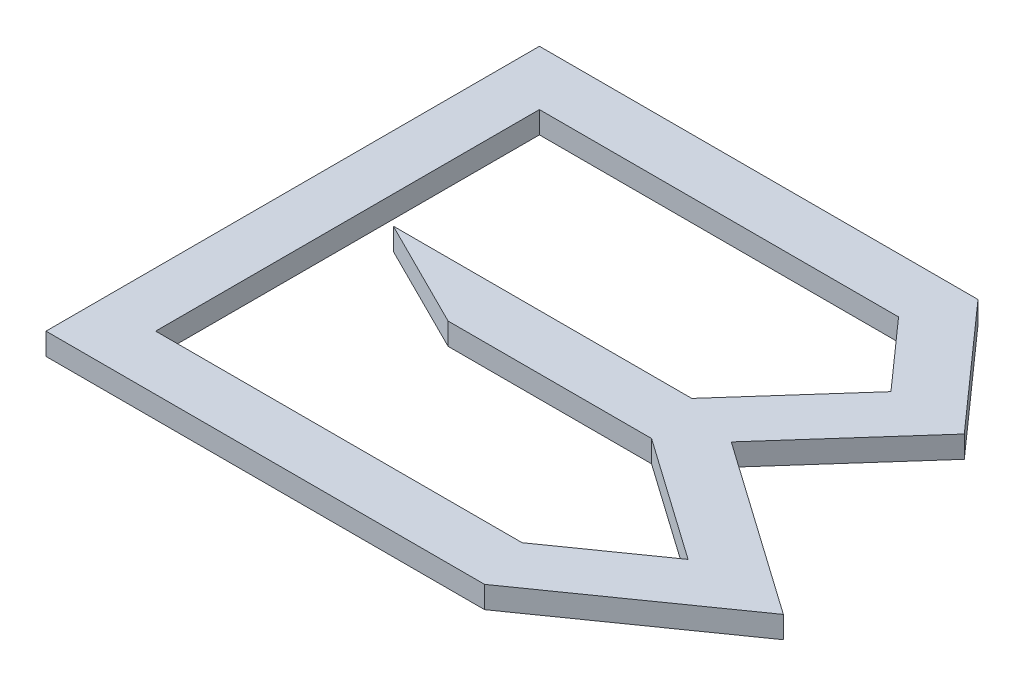
ISO-10303-21;
HEADER;
FILE_DESCRIPTION(('STEP AP214'),'2;1');
FILE_NAME('part.step','',(''),(''),'','','');
FILE_SCHEMA(('AUTOMOTIVE_DESIGN { 1 0 10303 214 1 1 1 1 }'));
ENDSEC;
DATA;
#1=APPLICATION_CONTEXT('core data for automotive mechanical design processes');
#2=APPLICATION_PROTOCOL_DEFINITION('international standard','automotive_design',2000,#1);
#3=PRODUCT_CONTEXT('',#1,'mechanical');
#4=PRODUCT('Part','Part','',(#3));
#5=PRODUCT_RELATED_PRODUCT_CATEGORY('part','',(#4));
#6=PRODUCT_DEFINITION_FORMATION('','',#4);
#7=PRODUCT_DEFINITION_CONTEXT('part definition',#1,'design');
#8=PRODUCT_DEFINITION('design','',#6,#7);
#9=PRODUCT_DEFINITION_SHAPE('','',#8);
#10=(LENGTH_UNIT() NAMED_UNIT(*) SI_UNIT(.MILLI.,.METRE.));
#11=(NAMED_UNIT(*) PLANE_ANGLE_UNIT() SI_UNIT($,.RADIAN.));
#12=(NAMED_UNIT(*) SI_UNIT($,.STERADIAN.) SOLID_ANGLE_UNIT());
#13=UNCERTAINTY_MEASURE_WITH_UNIT(LENGTH_MEASURE(1.E-05),#10,'distance_accuracy_value','');
#14=(GEOMETRIC_REPRESENTATION_CONTEXT(3) GLOBAL_UNCERTAINTY_ASSIGNED_CONTEXT((#13)) GLOBAL_UNIT_ASSIGNED_CONTEXT((#10,
#11,#12)) REPRESENTATION_CONTEXT('',''));
#15=CARTESIAN_POINT('',(0.,0.,0.));
#16=DIRECTION('',(0.,0.,1.));
#17=DIRECTION('',(1.,0.,0.));
#18=AXIS2_PLACEMENT_3D('',#15,#16,#17);
#19=CARTESIAN_POINT('',(0.,2.,0.));
#20=DIRECTION('',(0.,-1.,0.));
#21=DIRECTION('',(0.,0.,-1.));
#22=AXIS2_PLACEMENT_3D('',#19,#20,#21);
#23=PLANE('',#22);
#24=DIRECTION('',(1.,0.,0.));
#25=VECTOR('',#24,1.);
#26=CARTESIAN_POINT('',(17.5,2.,22.5));
#27=LINE('',#26,#25);
#28=CARTESIAN_POINT('',(-17.5,2.,22.5));
#29=VERTEX_POINT('',#28);
#30=CARTESIAN_POINT('',(22.5,2.,22.5));
#31=VERTEX_POINT('',#30);
#32=EDGE_CURVE('E235',#29,#31,#27,.T.);
#33=ORIENTED_EDGE('',*,*,#32,.T.);
#34=DIRECTION('',(0.818029158386142,0.,-0.575176751990256));
#35=VECTOR('',#34,1.);
#36=CARTESIAN_POINT('',(38.5,2.,11.25));
#37=LINE('',#36,#35);
#38=CARTESIAN_POINT('',(38.5,2.,11.25));
#39=VERTEX_POINT('',#38);
#40=EDGE_CURVE('E238',#31,#39,#37,.T.);
#41=ORIENTED_EDGE('',*,*,#40,.T.);
#42=DIRECTION('',(-0.818029158386142,0.,-0.575176751990256));
#43=VECTOR('',#42,1.);
#44=CARTESIAN_POINT('',(22.5,2.,0.));
#45=LINE('',#44,#43);
#46=CARTESIAN_POINT('',(22.5,2.,0.));
#47=VERTEX_POINT('',#46);
#48=EDGE_CURVE('E241',#39,#47,#45,.T.);
#49=ORIENTED_EDGE('',*,*,#48,.T.);
#50=DIRECTION('',(0.66436383882992,0.,-0.74740931868366));
#51=VECTOR('',#50,1.);
#52=CARTESIAN_POINT('',(32.5,2.,-11.25));
#53=LINE('',#52,#51);
#54=CARTESIAN_POINT('',(32.5,2.,-11.25));
#55=VERTEX_POINT('',#54);
#56=EDGE_CURVE('E243',#47,#55,#53,.T.);
#57=ORIENTED_EDGE('',*,*,#56,.T.);
#58=DIRECTION('',(-0.66436383882992,0.,-0.747409318683659));
#59=VECTOR('',#58,1.);
#60=CARTESIAN_POINT('',(22.5,2.,-22.5));
#61=LINE('',#60,#59);
#62=CARTESIAN_POINT('',(22.5,2.,-22.5));
#63=VERTEX_POINT('',#62);
#64=EDGE_CURVE('E245',#55,#63,#61,.T.);
#65=ORIENTED_EDGE('',*,*,#64,.T.);
#66=DIRECTION('',(-1.,0.,0.));
#67=VECTOR('',#66,1.);
#68=CARTESIAN_POINT('',(17.5,2.,-22.5));
#69=LINE('',#68,#67);
#70=CARTESIAN_POINT('',(-17.5,2.,-22.5));
#71=VERTEX_POINT('',#70);
#72=EDGE_CURVE('E247',#63,#71,#69,.T.);
#73=ORIENTED_EDGE('',*,*,#72,.T.);
#74=DIRECTION('',(0.,0.,1.));
#75=VECTOR('',#74,1.);
#76=CARTESIAN_POINT('',(-17.5,2.,-22.5));
#77=LINE('',#76,#75);
#78=EDGE_CURVE('E249',#71,#29,#77,.T.);
#79=ORIENTED_EDGE('',*,*,#78,.T.);
#80=EDGE_LOOP('',(#33,#41,#49,#57,#65,#73,#79));
#81=FACE_BOUND('',#80,.T.);
#82=DIRECTION('',(0.,0.,1.));
#83=VECTOR('',#82,1.);
#84=CARTESIAN_POINT('',(-12.5,2.,-17.5));
#85=LINE('',#84,#83);
#86=CARTESIAN_POINT('',(-12.5,2.,-17.5));
#87=VERTEX_POINT('',#86);
#88=CARTESIAN_POINT('',(-12.5,2.,17.5));
#89=VERTEX_POINT('',#88);
#90=EDGE_CURVE('E158',#87,#89,#85,.T.);
#91=ORIENTED_EDGE('',*,*,#90,.F.);
#92=DIRECTION('',(-1.,0.,0.));
#93=VECTOR('',#92,1.);
#94=CARTESIAN_POINT('',(-12.5,2.,-17.5));
#95=LINE('',#94,#93);
#96=CARTESIAN_POINT('',(20.2546696784487,2.,-17.5));
#97=VERTEX_POINT('',#96);
#98=EDGE_CURVE('E153',#97,#87,#95,.T.);
#99=ORIENTED_EDGE('',*,*,#98,.F.);
#100=DIRECTION('',(-0.66436383882992,0.,-0.747409318683659));
#101=VECTOR('',#100,1.);
#102=CARTESIAN_POINT('',(20.2546696784487,2.,-17.5));
#103=LINE('',#102,#101);
#104=CARTESIAN_POINT('',(25.8102252340043,2.,-11.25));
#105=VERTEX_POINT('',#104);
#106=EDGE_CURVE('E189',#105,#97,#103,.T.);
#107=ORIENTED_EDGE('',*,*,#106,.F.);
#108=DIRECTION('',(0.66436383882992,0.,-0.74740931868366));
#109=VECTOR('',#108,1.);
#110=CARTESIAN_POINT('',(25.8102252340043,2.,-11.25));
#111=LINE('',#110,#109);
#112=CARTESIAN_POINT('',(17.2619839057003,2.,-1.63322850565802));
#113=VERTEX_POINT('',#112);
#114=EDGE_CURVE('E187',#113,#105,#111,.T.);
#115=ORIENTED_EDGE('',*,*,#114,.F.);
#116=DIRECTION('',(1.,0.,0.));
#117=VECTOR('',#116,1.);
#118=CARTESIAN_POINT('',(15.0397616834781,2.,-1.63322850565802));
#119=LINE('',#118,#117);
#120=CARTESIAN_POINT('',(-9.96023831652193,2.,-1.63322850565802));
#121=VERTEX_POINT('',#120);
#122=EDGE_CURVE('E185',#121,#113,#119,.T.);
#123=ORIENTED_EDGE('',*,*,#122,.F.);
#124=DIRECTION('',(-0.894427190999916,0.,-0.447213595499958));
#125=VECTOR('',#124,1.);
#126=CARTESIAN_POINT('',(-9.96023831652193,2.,-1.63322850565802));
#127=LINE('',#126,#125);
#128=CARTESIAN_POINT('',(0.0397616834780772,2.,3.36677149434198));
#129=VERTEX_POINT('',#128);
#130=EDGE_CURVE('E183',#129,#121,#127,.T.);
#131=ORIENTED_EDGE('',*,*,#130,.F.);
#132=DIRECTION('',(-1.,0.,0.));
#133=VECTOR('',#132,1.);
#134=CARTESIAN_POINT('',(15.0397616834781,2.,3.36677149434198));
#135=LINE('',#134,#133);
#136=CARTESIAN_POINT('',(18.5953172390336,2.,3.36677149434198));
#137=VERTEX_POINT('',#136);
#138=EDGE_CURVE('E181',#137,#129,#135,.T.);
#139=ORIENTED_EDGE('',*,*,#138,.F.);
#140=DIRECTION('',(-0.818029158386142,0.,-0.575176751990256));
#141=VECTOR('',#140,1.);
#142=CARTESIAN_POINT('',(18.5953172390336,2.,3.36677149434198));
#143=LINE('',#142,#141);
#144=CARTESIAN_POINT('',(29.8070200026362,2.,11.25));
#145=VERTEX_POINT('',#144);
#146=EDGE_CURVE('E179',#145,#137,#143,.T.);
#147=ORIENTED_EDGE('',*,*,#146,.F.);
#148=DIRECTION('',(0.818029158386142,0.,-0.575176751990256));
#149=VECTOR('',#148,1.);
#150=CARTESIAN_POINT('',(29.8070200026362,2.,11.25));
#151=LINE('',#150,#149);
#152=CARTESIAN_POINT('',(20.9181311137473,2.,17.5));
#153=VERTEX_POINT('',#152);
#154=EDGE_CURVE('E175',#153,#145,#151,.T.);
#155=ORIENTED_EDGE('',*,*,#154,.F.);
#156=DIRECTION('',(1.,0.,0.));
#157=VECTOR('',#156,1.);
#158=CARTESIAN_POINT('',(-12.5,2.,17.5));
#159=LINE('',#158,#157);
#160=EDGE_CURVE('E173',#89,#153,#159,.T.);
#161=ORIENTED_EDGE('',*,*,#160,.F.);
#162=EDGE_LOOP('',(#91,#99,#107,#115,#123,#131,#139,#147,#155,#161));
#163=FACE_BOUND('',#162,.T.);
#164=ADVANCED_FACE('F37',(#81,#163),#23,.F.);
#165=CARTESIAN_POINT('',(0.,0.,0.));
#166=DIRECTION('',(0.,-1.,0.));
#167=DIRECTION('',(0.,0.,-1.));
#168=AXIS2_PLACEMENT_3D('',#165,#166,#167);
#169=PLANE('',#168);
#170=DIRECTION('',(0.818029158386142,0.,-0.575176751990256));
#171=VECTOR('',#170,1.);
#172=CARTESIAN_POINT('',(38.5,0.,11.25));
#173=LINE('',#172,#171);
#174=CARTESIAN_POINT('',(22.5,0.,22.5));
#175=VERTEX_POINT('',#174);
#176=CARTESIAN_POINT('',(38.5,0.,11.25));
#177=VERTEX_POINT('',#176);
#178=EDGE_CURVE('E168',#175,#177,#173,.T.);
#179=ORIENTED_EDGE('',*,*,#178,.F.);
#180=DIRECTION('',(1.,0.,0.));
#181=VECTOR('',#180,1.);
#182=CARTESIAN_POINT('',(-17.5,0.,22.5));
#183=LINE('',#182,#181);
#184=CARTESIAN_POINT('',(-17.5,0.,22.5));
#185=VERTEX_POINT('',#184);
#186=EDGE_CURVE('E239',#185,#175,#183,.T.);
#187=ORIENTED_EDGE('',*,*,#186,.F.);
#188=DIRECTION('',(0.,0.,1.));
#189=VECTOR('',#188,1.);
#190=CARTESIAN_POINT('',(-17.5,0.,-22.5));
#191=LINE('',#190,#189);
#192=CARTESIAN_POINT('',(-17.5,0.,-22.5));
#193=VERTEX_POINT('',#192);
#194=EDGE_CURVE('E263',#193,#185,#191,.T.);
#195=ORIENTED_EDGE('',*,*,#194,.F.);
#196=DIRECTION('',(-1.,0.,0.));
#197=VECTOR('',#196,1.);
#198=CARTESIAN_POINT('',(-17.5,0.,-22.5));
#199=LINE('',#198,#197);
#200=CARTESIAN_POINT('',(22.5,0.,-22.5));
#201=VERTEX_POINT('',#200);
#202=EDGE_CURVE('E261',#201,#193,#199,.T.);
#203=ORIENTED_EDGE('',*,*,#202,.F.);
#204=DIRECTION('',(-0.66436383882992,0.,-0.747409318683659));
#205=VECTOR('',#204,1.);
#206=CARTESIAN_POINT('',(22.5,0.,-22.5));
#207=LINE('',#206,#205);
#208=CARTESIAN_POINT('',(32.5,0.,-11.25));
#209=VERTEX_POINT('',#208);
#210=EDGE_CURVE('E258',#209,#201,#207,.T.);
#211=ORIENTED_EDGE('',*,*,#210,.F.);
#212=DIRECTION('',(0.66436383882992,0.,-0.74740931868366));
#213=VECTOR('',#212,1.);
#214=CARTESIAN_POINT('',(32.5,0.,-11.25));
#215=LINE('',#214,#213);
#216=CARTESIAN_POINT('',(22.5,0.,0.));
#217=VERTEX_POINT('',#216);
#218=EDGE_CURVE('E256',#217,#209,#215,.T.);
#219=ORIENTED_EDGE('',*,*,#218,.F.);
#220=DIRECTION('',(-0.818029158386142,0.,-0.575176751990256));
#221=VECTOR('',#220,1.);
#222=CARTESIAN_POINT('',(22.5,0.,0.));
#223=LINE('',#222,#221);
#224=EDGE_CURVE('E254',#177,#217,#223,.T.);
#225=ORIENTED_EDGE('',*,*,#224,.F.);
#226=EDGE_LOOP('',(#179,#187,#195,#203,#211,#219,#225));
#227=FACE_BOUND('',#226,.T.);
#228=DIRECTION('',(-1.,0.,0.));
#229=VECTOR('',#228,1.);
#230=CARTESIAN_POINT('',(17.5,0.,-17.5));
#231=LINE('',#230,#229);
#232=CARTESIAN_POINT('',(20.2546696784487,0.,-17.5));
#233=VERTEX_POINT('',#232);
#234=CARTESIAN_POINT('',(-12.5,0.,-17.5));
#235=VERTEX_POINT('',#234);
#236=EDGE_CURVE('E159',#233,#235,#231,.T.);
#237=ORIENTED_EDGE('',*,*,#236,.T.);
#238=DIRECTION('',(0.,0.,1.));
#239=VECTOR('',#238,1.);
#240=CARTESIAN_POINT('',(-12.5,0.,-17.5));
#241=LINE('',#240,#239);
#242=CARTESIAN_POINT('',(-12.5,0.,17.5));
#243=VERTEX_POINT('',#242);
#244=EDGE_CURVE('E166',#235,#243,#241,.T.);
#245=ORIENTED_EDGE('',*,*,#244,.T.);
#246=DIRECTION('',(1.,0.,0.));
#247=VECTOR('',#246,1.);
#248=CARTESIAN_POINT('',(17.5,0.,17.5));
#249=LINE('',#248,#247);
#250=CARTESIAN_POINT('',(20.9181311137473,0.,17.5));
#251=VERTEX_POINT('',#250);
#252=EDGE_CURVE('E192',#243,#251,#249,.T.);
#253=ORIENTED_EDGE('',*,*,#252,.T.);
#254=DIRECTION('',(0.818029158386142,0.,-0.575176751990256));
#255=VECTOR('',#254,1.);
#256=CARTESIAN_POINT('',(29.8070200026362,0.,11.25));
#257=LINE('',#256,#255);
#258=CARTESIAN_POINT('',(29.8070200026362,0.,11.25));
#259=VERTEX_POINT('',#258);
#260=EDGE_CURVE('E195',#251,#259,#257,.T.);
#261=ORIENTED_EDGE('',*,*,#260,.T.);
#262=DIRECTION('',(-0.818029158386142,0.,-0.575176751990256));
#263=VECTOR('',#262,1.);
#264=CARTESIAN_POINT('',(18.5953172390336,0.,3.36677149434198));
#265=LINE('',#264,#263);
#266=CARTESIAN_POINT('',(18.5953172390336,0.,3.36677149434198));
#267=VERTEX_POINT('',#266);
#268=EDGE_CURVE('E198',#259,#267,#265,.T.);
#269=ORIENTED_EDGE('',*,*,#268,.T.);
#270=DIRECTION('',(-1.,0.,0.));
#271=VECTOR('',#270,1.);
#272=CARTESIAN_POINT('',(15.0397616834781,0.,3.36677149434198));
#273=LINE('',#272,#271);
#274=CARTESIAN_POINT('',(0.0397616834780772,0.,3.36677149434198));
#275=VERTEX_POINT('',#274);
#276=EDGE_CURVE('E201',#267,#275,#273,.T.);
#277=ORIENTED_EDGE('',*,*,#276,.T.);
#278=DIRECTION('',(-0.894427190999916,0.,-0.447213595499958));
#279=VECTOR('',#278,1.);
#280=CARTESIAN_POINT('',(-9.96023831652193,0.,-1.63322850565802));
#281=LINE('',#280,#279);
#282=CARTESIAN_POINT('',(-9.96023831652193,0.,-1.63322850565802));
#283=VERTEX_POINT('',#282);
#284=EDGE_CURVE('E204',#275,#283,#281,.T.);
#285=ORIENTED_EDGE('',*,*,#284,.T.);
#286=DIRECTION('',(1.,0.,0.));
#287=VECTOR('',#286,1.);
#288=CARTESIAN_POINT('',(15.0397616834781,0.,-1.63322850565802));
#289=LINE('',#288,#287);
#290=CARTESIAN_POINT('',(17.2619839057003,0.,-1.63322850565802));
#291=VERTEX_POINT('',#290);
#292=EDGE_CURVE('E207',#283,#291,#289,.T.);
#293=ORIENTED_EDGE('',*,*,#292,.T.);
#294=DIRECTION('',(0.66436383882992,0.,-0.74740931868366));
#295=VECTOR('',#294,1.);
#296=CARTESIAN_POINT('',(25.8102252340043,0.,-11.25));
#297=LINE('',#296,#295);
#298=CARTESIAN_POINT('',(25.8102252340043,0.,-11.25));
#299=VERTEX_POINT('',#298);
#300=EDGE_CURVE('E210',#291,#299,#297,.T.);
#301=ORIENTED_EDGE('',*,*,#300,.T.);
#302=DIRECTION('',(-0.66436383882992,0.,-0.747409318683659));
#303=VECTOR('',#302,1.);
#304=CARTESIAN_POINT('',(20.2546696784487,0.,-17.5));
#305=LINE('',#304,#303);
#306=EDGE_CURVE('E213',#299,#233,#305,.T.);
#307=ORIENTED_EDGE('',*,*,#306,.T.);
#308=EDGE_LOOP('',(#237,#245,#253,#261,#269,#277,#285,#293,#301,#307));
#309=FACE_BOUND('',#308,.T.);
#310=ADVANCED_FACE('F290',(#227,#309),#169,.T.);
#311=CARTESIAN_POINT('',(38.5,2.,11.25));
#312=DIRECTION('',(-0.575176751990256,0.,-0.818029158386142));
#313=DIRECTION('',(-0.818029158386142,0.,0.575176751990256));
#314=AXIS2_PLACEMENT_3D('',#311,#312,#313);
#315=PLANE('',#314);
#316=ORIENTED_EDGE('',*,*,#178,.T.);
#317=DIRECTION('',(0.,-1.,0.));
#318=VECTOR('',#317,1.);
#319=CARTESIAN_POINT('',(38.5,2.,11.25));
#320=LINE('',#319,#318);
#321=EDGE_CURVE('E45',#39,#177,#320,.T.);
#322=ORIENTED_EDGE('',*,*,#321,.F.);
#323=ORIENTED_EDGE('',*,*,#40,.F.);
#324=DIRECTION('',(0.,-1.,0.));
#325=VECTOR('',#324,1.);
#326=CARTESIAN_POINT('',(22.5,2.,22.5));
#327=LINE('',#326,#325);
#328=EDGE_CURVE('E11',#31,#175,#327,.T.);
#329=ORIENTED_EDGE('',*,*,#328,.T.);
#330=EDGE_LOOP('',(#316,#322,#323,#329));
#331=FACE_BOUND('',#330,.T.);
#332=ADVANCED_FACE('F39',(#331),#315,.F.);
#333=CARTESIAN_POINT('',(22.5,2.,0.));
#334=DIRECTION('',(-0.575176751990256,0.,0.818029158386142));
#335=DIRECTION('',(0.818029158386142,0.,0.575176751990256));
#336=AXIS2_PLACEMENT_3D('',#333,#334,#335);
#337=PLANE('',#336);
#338=ORIENTED_EDGE('',*,*,#224,.T.);
#339=DIRECTION('',(0.,-1.,0.));
#340=VECTOR('',#339,1.);
#341=CARTESIAN_POINT('',(22.5,2.,0.));
#342=LINE('',#341,#340);
#343=EDGE_CURVE('E277',#47,#217,#342,.T.);
#344=ORIENTED_EDGE('',*,*,#343,.F.);
#345=ORIENTED_EDGE('',*,*,#48,.F.);
#346=ORIENTED_EDGE('',*,*,#321,.T.);
#347=EDGE_LOOP('',(#338,#344,#345,#346));
#348=FACE_BOUND('',#347,.T.);
#349=ADVANCED_FACE('F284',(#348),#337,.F.);
#350=CARTESIAN_POINT('',(32.5,2.,-11.25));
#351=DIRECTION('',(-0.74740931868366,0.,-0.66436383882992));
#352=DIRECTION('',(-0.66436383882992,0.,0.74740931868366));
#353=AXIS2_PLACEMENT_3D('',#350,#351,#352);
#354=PLANE('',#353);
#355=ORIENTED_EDGE('',*,*,#218,.T.);
#356=DIRECTION('',(0.,-1.,0.));
#357=VECTOR('',#356,1.);
#358=CARTESIAN_POINT('',(32.5,2.,-11.25));
#359=LINE('',#358,#357);
#360=EDGE_CURVE('E274',#55,#209,#359,.T.);
#361=ORIENTED_EDGE('',*,*,#360,.F.);
#362=ORIENTED_EDGE('',*,*,#56,.F.);
#363=ORIENTED_EDGE('',*,*,#343,.T.);
#364=EDGE_LOOP('',(#355,#361,#362,#363));
#365=FACE_BOUND('',#364,.T.);
#366=ADVANCED_FACE('F296',(#365),#354,.F.);
#367=CARTESIAN_POINT('',(22.5,2.,-22.5));
#368=DIRECTION('',(-0.74740931868366,0.,0.66436383882992));
#369=DIRECTION('',(0.66436383882992,0.,0.74740931868366));
#370=AXIS2_PLACEMENT_3D('',#367,#368,#369);
#371=PLANE('',#370);
#372=ORIENTED_EDGE('',*,*,#210,.T.);
#373=DIRECTION('',(0.,-1.,0.));
#374=VECTOR('',#373,1.);
#375=CARTESIAN_POINT('',(22.5,2.,-22.5));
#376=LINE('',#375,#374);
#377=EDGE_CURVE('E271',#63,#201,#376,.T.);
#378=ORIENTED_EDGE('',*,*,#377,.F.);
#379=ORIENTED_EDGE('',*,*,#64,.F.);
#380=ORIENTED_EDGE('',*,*,#360,.T.);
#381=EDGE_LOOP('',(#372,#378,#379,#380));
#382=FACE_BOUND('',#381,.T.);
#383=ADVANCED_FACE('F300',(#382),#371,.F.);
#384=CARTESIAN_POINT('',(-17.5,2.,-22.5));
#385=DIRECTION('',(0.,0.,1.));
#386=DIRECTION('',(1.,0.,0.));
#387=AXIS2_PLACEMENT_3D('',#384,#385,#386);
#388=PLANE('',#387);
#389=ORIENTED_EDGE('',*,*,#202,.T.);
#390=DIRECTION('',(0.,-1.,0.));
#391=VECTOR('',#390,1.);
#392=CARTESIAN_POINT('',(-17.5,2.,-22.5));
#393=LINE('',#392,#391);
#394=EDGE_CURVE('E268',#71,#193,#393,.T.);
#395=ORIENTED_EDGE('',*,*,#394,.F.);
#396=ORIENTED_EDGE('',*,*,#72,.F.);
#397=ORIENTED_EDGE('',*,*,#377,.T.);
#398=EDGE_LOOP('',(#389,#395,#396,#397));
#399=FACE_BOUND('',#398,.T.);
#400=ADVANCED_FACE('F314',(#399),#388,.F.);
#401=CARTESIAN_POINT('',(-17.5,2.,-22.5));
#402=DIRECTION('',(1.,0.,0.));
#403=DIRECTION('',(0.,0.,-1.));
#404=AXIS2_PLACEMENT_3D('',#401,#402,#403);
#405=PLANE('',#404);
#406=ORIENTED_EDGE('',*,*,#194,.T.);
#407=DIRECTION('',(0.,-1.,0.));
#408=VECTOR('',#407,1.);
#409=CARTESIAN_POINT('',(-17.5,2.,22.5));
#410=LINE('',#409,#408);
#411=EDGE_CURVE('E252',#29,#185,#410,.T.);
#412=ORIENTED_EDGE('',*,*,#411,.F.);
#413=ORIENTED_EDGE('',*,*,#78,.F.);
#414=ORIENTED_EDGE('',*,*,#394,.T.);
#415=EDGE_LOOP('',(#406,#412,#413,#414));
#416=FACE_BOUND('',#415,.T.);
#417=ADVANCED_FACE('F311',(#416),#405,.F.);
#418=CARTESIAN_POINT('',(-17.5,2.,22.5));
#419=DIRECTION('',(0.,0.,-1.));
#420=DIRECTION('',(-1.,0.,0.));
#421=AXIS2_PLACEMENT_3D('',#418,#419,#420);
#422=PLANE('',#421);
#423=ORIENTED_EDGE('',*,*,#186,.T.);
#424=ORIENTED_EDGE('',*,*,#328,.F.);
#425=ORIENTED_EDGE('',*,*,#32,.F.);
#426=ORIENTED_EDGE('',*,*,#411,.T.);
#427=EDGE_LOOP('',(#423,#424,#425,#426));
#428=FACE_BOUND('',#427,.T.);
#429=ADVANCED_FACE('F307',(#428),#422,.F.);
#430=CARTESIAN_POINT('',(-12.5,2.,-17.5));
#431=DIRECTION('',(1.,0.,0.));
#432=DIRECTION('',(0.,0.,-1.));
#433=AXIS2_PLACEMENT_3D('',#430,#431,#432);
#434=PLANE('',#433);
#435=ORIENTED_EDGE('',*,*,#244,.F.);
#436=DIRECTION('',(0.,-1.,0.));
#437=VECTOR('',#436,1.);
#438=CARTESIAN_POINT('',(-12.5,2.,-17.5));
#439=LINE('',#438,#437);
#440=EDGE_CURVE('E57',#87,#235,#439,.T.);
#441=ORIENTED_EDGE('',*,*,#440,.F.);
#442=ORIENTED_EDGE('',*,*,#90,.T.);
#443=DIRECTION('',(0.,-1.,0.));
#444=VECTOR('',#443,1.);
#445=CARTESIAN_POINT('',(-12.5,2.,17.5));
#446=LINE('',#445,#444);
#447=EDGE_CURVE('E169',#89,#243,#446,.T.);
#448=ORIENTED_EDGE('',*,*,#447,.T.);
#449=EDGE_LOOP('',(#435,#441,#442,#448));
#450=FACE_BOUND('',#449,.T.);
#451=ADVANCED_FACE('F162',(#450),#434,.T.);
#452=CARTESIAN_POINT('',(17.5,2.,17.5));
#453=DIRECTION('',(0.,0.,-1.));
#454=DIRECTION('',(-1.,0.,0.));
#455=AXIS2_PLACEMENT_3D('',#452,#453,#454);
#456=PLANE('',#455);
#457=ORIENTED_EDGE('',*,*,#252,.F.);
#458=ORIENTED_EDGE('',*,*,#447,.F.);
#459=ORIENTED_EDGE('',*,*,#160,.T.);
#460=DIRECTION('',(0.,-1.,0.));
#461=VECTOR('',#460,1.);
#462=CARTESIAN_POINT('',(20.9181311137473,2.,17.5));
#463=LINE('',#462,#461);
#464=EDGE_CURVE('E232',#153,#251,#463,.T.);
#465=ORIENTED_EDGE('',*,*,#464,.T.);
#466=EDGE_LOOP('',(#457,#458,#459,#465));
#467=FACE_BOUND('',#466,.T.);
#468=ADVANCED_FACE('F336',(#467),#456,.T.);
#469=CARTESIAN_POINT('',(29.8070200026362,2.,11.25));
#470=DIRECTION('',(-0.575176751990256,0.,-0.818029158386142));
#471=DIRECTION('',(-0.818029158386142,0.,0.575176751990256));
#472=AXIS2_PLACEMENT_3D('',#469,#470,#471);
#473=PLANE('',#472);
#474=ORIENTED_EDGE('',*,*,#260,.F.);
#475=ORIENTED_EDGE('',*,*,#464,.F.);
#476=ORIENTED_EDGE('',*,*,#154,.T.);
#477=DIRECTION('',(0.,-1.,0.));
#478=VECTOR('',#477,1.);
#479=CARTESIAN_POINT('',(29.8070200026362,2.,11.25));
#480=LINE('',#479,#478);
#481=EDGE_CURVE('E230',#145,#259,#480,.T.);
#482=ORIENTED_EDGE('',*,*,#481,.T.);
#483=EDGE_LOOP('',(#474,#475,#476,#482));
#484=FACE_BOUND('',#483,.T.);
#485=ADVANCED_FACE('F340',(#484),#473,.T.);
#486=CARTESIAN_POINT('',(18.5953172390336,2.,3.36677149434198));
#487=DIRECTION('',(-0.575176751990256,0.,0.818029158386142));
#488=DIRECTION('',(0.818029158386142,0.,0.575176751990256));
#489=AXIS2_PLACEMENT_3D('',#486,#487,#488);
#490=PLANE('',#489);
#491=ORIENTED_EDGE('',*,*,#268,.F.);
#492=ORIENTED_EDGE('',*,*,#481,.F.);
#493=ORIENTED_EDGE('',*,*,#146,.T.);
#494=DIRECTION('',(0.,-1.,0.));
#495=VECTOR('',#494,1.);
#496=CARTESIAN_POINT('',(18.5953172390336,2.,3.36677149434198));
#497=LINE('',#496,#495);
#498=EDGE_CURVE('E227',#137,#267,#497,.T.);
#499=ORIENTED_EDGE('',*,*,#498,.T.);
#500=EDGE_LOOP('',(#491,#492,#493,#499));
#501=FACE_BOUND('',#500,.T.);
#502=ADVANCED_FACE('F345',(#501),#490,.T.);
#503=CARTESIAN_POINT('',(15.0397616834781,2.,3.36677149434198));
#504=DIRECTION('',(0.,0.,1.));
#505=DIRECTION('',(1.,0.,0.));
#506=AXIS2_PLACEMENT_3D('',#503,#504,#505);
#507=PLANE('',#506);
#508=ORIENTED_EDGE('',*,*,#276,.F.);
#509=ORIENTED_EDGE('',*,*,#498,.F.);
#510=ORIENTED_EDGE('',*,*,#138,.T.);
#511=DIRECTION('',(0.,-1.,0.));
#512=VECTOR('',#511,1.);
#513=CARTESIAN_POINT('',(0.0397616834780772,2.,3.36677149434198));
#514=LINE('',#513,#512);
#515=EDGE_CURVE('E225',#129,#275,#514,.T.);
#516=ORIENTED_EDGE('',*,*,#515,.T.);
#517=EDGE_LOOP('',(#508,#509,#510,#516));
#518=FACE_BOUND('',#517,.T.);
#519=ADVANCED_FACE('F351',(#518),#507,.T.);
#520=CARTESIAN_POINT('',(-9.96023831652193,2.,-1.63322850565802));
#521=DIRECTION('',(-0.447213595499958,0.,0.894427190999916));
#522=DIRECTION('',(0.894427190999916,0.,0.447213595499958));
#523=AXIS2_PLACEMENT_3D('',#520,#521,#522);
#524=PLANE('',#523);
#525=ORIENTED_EDGE('',*,*,#284,.F.);
#526=ORIENTED_EDGE('',*,*,#515,.F.);
#527=ORIENTED_EDGE('',*,*,#130,.T.);
#528=DIRECTION('',(0.,-1.,0.));
#529=VECTOR('',#528,1.);
#530=CARTESIAN_POINT('',(-9.96023831652193,2.,-1.63322850565802));
#531=LINE('',#530,#529);
#532=EDGE_CURVE('E222',#121,#283,#531,.T.);
#533=ORIENTED_EDGE('',*,*,#532,.T.);
#534=EDGE_LOOP('',(#525,#526,#527,#533));
#535=FACE_BOUND('',#534,.T.);
#536=ADVANCED_FACE('F355',(#535),#524,.T.);
#537=CARTESIAN_POINT('',(15.0397616834781,2.,-1.63322850565802));
#538=DIRECTION('',(0.,0.,-1.));
#539=DIRECTION('',(-1.,0.,0.));
#540=AXIS2_PLACEMENT_3D('',#537,#538,#539);
#541=PLANE('',#540);
#542=ORIENTED_EDGE('',*,*,#292,.F.);
#543=ORIENTED_EDGE('',*,*,#532,.F.);
#544=ORIENTED_EDGE('',*,*,#122,.T.);
#545=DIRECTION('',(0.,-1.,0.));
#546=VECTOR('',#545,1.);
#547=CARTESIAN_POINT('',(17.2619839057003,2.,-1.63322850565802));
#548=LINE('',#547,#546);
#549=EDGE_CURVE('E220',#113,#291,#548,.T.);
#550=ORIENTED_EDGE('',*,*,#549,.T.);
#551=EDGE_LOOP('',(#542,#543,#544,#550));
#552=FACE_BOUND('',#551,.T.);
#553=ADVANCED_FACE('F359',(#552),#541,.T.);
#554=CARTESIAN_POINT('',(25.8102252340043,2.,-11.25));
#555=DIRECTION('',(-0.74740931868366,0.,-0.66436383882992));
#556=DIRECTION('',(-0.66436383882992,0.,0.74740931868366));
#557=AXIS2_PLACEMENT_3D('',#554,#555,#556);
#558=PLANE('',#557);
#559=ORIENTED_EDGE('',*,*,#300,.F.);
#560=ORIENTED_EDGE('',*,*,#549,.F.);
#561=ORIENTED_EDGE('',*,*,#114,.T.);
#562=DIRECTION('',(0.,-1.,0.));
#563=VECTOR('',#562,1.);
#564=CARTESIAN_POINT('',(25.8102252340043,2.,-11.25));
#565=LINE('',#564,#563);
#566=EDGE_CURVE('E218',#105,#299,#565,.T.);
#567=ORIENTED_EDGE('',*,*,#566,.T.);
#568=EDGE_LOOP('',(#559,#560,#561,#567));
#569=FACE_BOUND('',#568,.T.);
#570=ADVANCED_FACE('F363',(#569),#558,.T.);
#571=CARTESIAN_POINT('',(20.2546696784487,2.,-17.5));
#572=DIRECTION('',(-0.74740931868366,0.,0.66436383882992));
#573=DIRECTION('',(0.66436383882992,0.,0.74740931868366));
#574=AXIS2_PLACEMENT_3D('',#571,#572,#573);
#575=PLANE('',#574);
#576=ORIENTED_EDGE('',*,*,#306,.F.);
#577=ORIENTED_EDGE('',*,*,#566,.F.);
#578=ORIENTED_EDGE('',*,*,#106,.T.);
#579=DIRECTION('',(0.,-1.,0.));
#580=VECTOR('',#579,1.);
#581=CARTESIAN_POINT('',(20.2546696784487,2.,-17.5));
#582=LINE('',#581,#580);
#583=EDGE_CURVE('E52',#97,#233,#582,.T.);
#584=ORIENTED_EDGE('',*,*,#583,.T.);
#585=EDGE_LOOP('',(#576,#577,#578,#584));
#586=FACE_BOUND('',#585,.T.);
#587=ADVANCED_FACE('F367',(#586),#575,.T.);
#588=CARTESIAN_POINT('',(17.5,2.,-17.5));
#589=DIRECTION('',(0.,0.,1.));
#590=DIRECTION('',(1.,0.,0.));
#591=AXIS2_PLACEMENT_3D('',#588,#589,#590);
#592=PLANE('',#591);
#593=ORIENTED_EDGE('',*,*,#236,.F.);
#594=ORIENTED_EDGE('',*,*,#583,.F.);
#595=ORIENTED_EDGE('',*,*,#98,.T.);
#596=ORIENTED_EDGE('',*,*,#440,.T.);
#597=EDGE_LOOP('',(#593,#594,#595,#596));
#598=FACE_BOUND('',#597,.T.);
#599=ADVANCED_FACE('F154',(#598),#592,.T.);
#600=CLOSED_SHELL('',(#164,#310,#332,#349,#366,#383,#400,#417,#429,#451,#468,#485,#502,#519,
#536,#553,#570,#587,#599));
#601=MANIFOLD_SOLID_BREP('B2',#600);
#602=ADVANCED_BREP_SHAPE_REPRESENTATION('',(#18,#601),#14);
#603=SHAPE_DEFINITION_REPRESENTATION(#9,#602);
ENDSEC;
END-ISO-10303-21;
